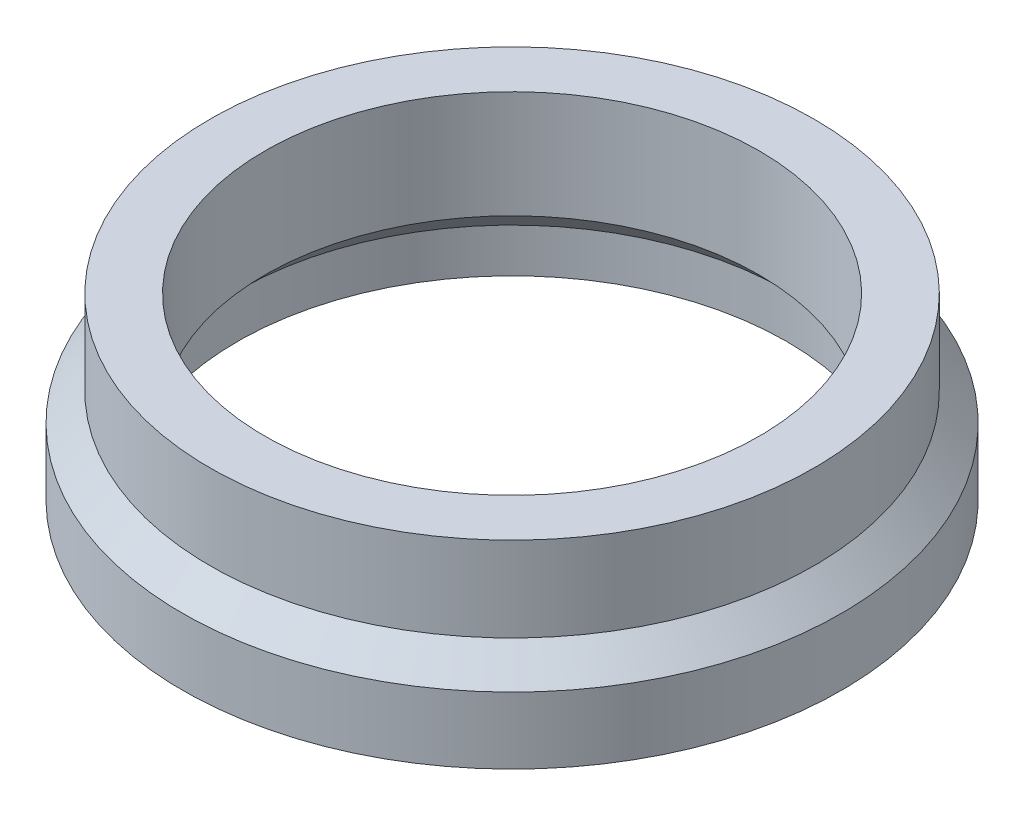
ISO-10303-21;
HEADER;
FILE_DESCRIPTION(('STEP AP214'),'2;1');
FILE_NAME('part.step','',(''),(''),'','','');
FILE_SCHEMA(('AUTOMOTIVE_DESIGN { 1 0 10303 214 1 1 1 1 }'));
ENDSEC;
DATA;
#1=APPLICATION_CONTEXT('core data for automotive mechanical design processes');
#2=APPLICATION_PROTOCOL_DEFINITION('international standard','automotive_design',2000,#1);
#3=PRODUCT_CONTEXT('',#1,'mechanical');
#4=PRODUCT('Part','Part','',(#3));
#5=PRODUCT_RELATED_PRODUCT_CATEGORY('part','',(#4));
#6=PRODUCT_DEFINITION_FORMATION('','',#4);
#7=PRODUCT_DEFINITION_CONTEXT('part definition',#1,'design');
#8=PRODUCT_DEFINITION('design','',#6,#7);
#9=PRODUCT_DEFINITION_SHAPE('','',#8);
#10=(LENGTH_UNIT() NAMED_UNIT(*) SI_UNIT(.MILLI.,.METRE.));
#11=(NAMED_UNIT(*) PLANE_ANGLE_UNIT() SI_UNIT($,.RADIAN.));
#12=(NAMED_UNIT(*) SI_UNIT($,.STERADIAN.) SOLID_ANGLE_UNIT());
#13=UNCERTAINTY_MEASURE_WITH_UNIT(LENGTH_MEASURE(1.E-05),#10,'distance_accuracy_value','');
#14=(GEOMETRIC_REPRESENTATION_CONTEXT(3) GLOBAL_UNCERTAINTY_ASSIGNED_CONTEXT((#13)) GLOBAL_UNIT_ASSIGNED_CONTEXT((#10,
#11,#12)) REPRESENTATION_CONTEXT('',''));
#15=CARTESIAN_POINT('',(0.,0.,0.));
#16=DIRECTION('',(0.,0.,1.));
#17=DIRECTION('',(1.,0.,0.));
#18=AXIS2_PLACEMENT_3D('',#15,#16,#17);
#19=CARTESIAN_POINT('',(-5.,0.,0.));
#20=DIRECTION('',(0.,1.,0.));
#21=DIRECTION('',(0.,0.,1.));
#22=AXIS2_PLACEMENT_3D('',#19,#20,#21);
#23=PLANE('',#22);
#24=CARTESIAN_POINT('',(0.,0.,0.));
#25=DIRECTION('',(0.,-1.,0.));
#26=DIRECTION('',(0.,0.,-1.));
#27=AXIS2_PLACEMENT_3D('',#24,#25,#26);
#28=CIRCLE('',#27,5.);
#29=CARTESIAN_POINT('',(0.,0.,-5.));
#30=VERTEX_POINT('',#29);
#31=EDGE_CURVE('E62',#30,#30,#28,.T.);
#32=ORIENTED_EDGE('',*,*,#31,.F.);
#33=EDGE_LOOP('',(#32));
#34=FACE_BOUND('',#33,.T.);
#35=CARTESIAN_POINT('',(0.,0.,0.));
#36=DIRECTION('',(0.,-1.,0.));
#37=DIRECTION('',(0.,0.,-1.));
#38=AXIS2_PLACEMENT_3D('',#35,#36,#37);
#39=CIRCLE('',#38,6.);
#40=CARTESIAN_POINT('',(0.,0.,-6.));
#41=VERTEX_POINT('',#40);
#42=EDGE_CURVE('E10',#41,#41,#39,.T.);
#43=ORIENTED_EDGE('',*,*,#42,.T.);
#44=EDGE_LOOP('',(#43));
#45=FACE_BOUND('',#44,.T.);
#46=ADVANCED_FACE('F34',(#34,#45),#23,.F.);
#47=CARTESIAN_POINT('',(0.,0.,0.));
#48=DIRECTION('',(0.,-1.,0.));
#49=DIRECTION('',(0.,0.,-1.));
#50=AXIS2_PLACEMENT_3D('',#47,#48,#49);
#51=CYLINDRICAL_SURFACE('',#50,6.);
#52=ORIENTED_EDGE('',*,*,#42,.F.);
#53=EDGE_LOOP('',(#52));
#54=FACE_BOUND('',#53,.T.);
#55=CARTESIAN_POINT('',(0.,1.2142135623731,0.));
#56=DIRECTION('',(0.,-1.,0.));
#57=DIRECTION('',(0.,0.,-1.));
#58=AXIS2_PLACEMENT_3D('',#55,#56,#57);
#59=CIRCLE('',#58,6.);
#60=CARTESIAN_POINT('',(0.,1.2142135623731,-6.));
#61=VERTEX_POINT('',#60);
#62=EDGE_CURVE('E40',#61,#61,#59,.T.);
#63=ORIENTED_EDGE('',*,*,#62,.T.);
#64=EDGE_LOOP('',(#63));
#65=FACE_BOUND('',#64,.T.);
#66=ADVANCED_FACE('F69',(#54,#65),#51,.T.);
#67=CARTESIAN_POINT('',(0.,1.7142135623731,0.));
#68=DIRECTION('',(0.,-1.,0.));
#69=DIRECTION('',(0.,0.,-1.));
#70=AXIS2_PLACEMENT_3D('',#67,#68,#69);
#71=CONICAL_SURFACE('',#70,5.5,0.785398163397448);
#72=ORIENTED_EDGE('',*,*,#62,.F.);
#73=EDGE_LOOP('',(#72));
#74=FACE_BOUND('',#73,.T.);
#75=CARTESIAN_POINT('',(0.,1.7142135623731,0.));
#76=DIRECTION('',(0.,-1.,0.));
#77=DIRECTION('',(0.,0.,-1.));
#78=AXIS2_PLACEMENT_3D('',#75,#76,#77);
#79=CIRCLE('',#78,5.5);
#80=CARTESIAN_POINT('',(0.,1.7142135623731,-5.5));
#81=VERTEX_POINT('',#80);
#82=EDGE_CURVE('E44',#81,#81,#79,.T.);
#83=ORIENTED_EDGE('',*,*,#82,.T.);
#84=EDGE_LOOP('',(#83));
#85=FACE_BOUND('',#84,.T.);
#86=ADVANCED_FACE('F73',(#74,#85),#71,.T.);
#87=CARTESIAN_POINT('',(0.,0.,0.));
#88=DIRECTION('',(0.,-1.,0.));
#89=DIRECTION('',(0.,0.,-1.));
#90=AXIS2_PLACEMENT_3D('',#87,#88,#89);
#91=CYLINDRICAL_SURFACE('',#90,5.5);
#92=ORIENTED_EDGE('',*,*,#82,.F.);
#93=EDGE_LOOP('',(#92));
#94=FACE_BOUND('',#93,.T.);
#95=CARTESIAN_POINT('',(0.,3.25638793857598,0.));
#96=DIRECTION('',(0.,-1.,0.));
#97=DIRECTION('',(0.,0.,-1.));
#98=AXIS2_PLACEMENT_3D('',#95,#96,#97);
#99=CIRCLE('',#98,5.5);
#100=CARTESIAN_POINT('',(0.,3.25638793857598,-5.5));
#101=VERTEX_POINT('',#100);
#102=EDGE_CURVE('E48',#101,#101,#99,.T.);
#103=ORIENTED_EDGE('',*,*,#102,.T.);
#104=EDGE_LOOP('',(#103));
#105=FACE_BOUND('',#104,.T.);
#106=ADVANCED_FACE('F78',(#94,#105),#91,.T.);
#107=CARTESIAN_POINT('',(-5.5,3.25638793857598,0.));
#108=DIRECTION('',(0.,-1.,0.));
#109=DIRECTION('',(0.,0.,-1.));
#110=AXIS2_PLACEMENT_3D('',#107,#108,#109);
#111=PLANE('',#110);
#112=ORIENTED_EDGE('',*,*,#102,.F.);
#113=EDGE_LOOP('',(#112));
#114=FACE_BOUND('',#113,.T.);
#115=CARTESIAN_POINT('',(0.,3.25638793857598,0.));
#116=DIRECTION('',(0.,-1.,0.));
#117=DIRECTION('',(0.,0.,-1.));
#118=AXIS2_PLACEMENT_3D('',#115,#116,#117);
#119=CIRCLE('',#118,4.5);
#120=CARTESIAN_POINT('',(0.,3.25638793857598,-4.5));
#121=VERTEX_POINT('',#120);
#122=EDGE_CURVE('E53',#121,#121,#119,.T.);
#123=ORIENTED_EDGE('',*,*,#122,.T.);
#124=EDGE_LOOP('',(#123));
#125=FACE_BOUND('',#124,.T.);
#126=ADVANCED_FACE('F84',(#114,#125),#111,.F.);
#127=CARTESIAN_POINT('',(0.,0.,0.));
#128=DIRECTION('',(0.,-1.,0.));
#129=DIRECTION('',(0.,0.,-1.));
#130=AXIS2_PLACEMENT_3D('',#127,#128,#129);
#131=CYLINDRICAL_SURFACE('',#130,4.5);
#132=ORIENTED_EDGE('',*,*,#122,.F.);
#133=EDGE_LOOP('',(#132));
#134=FACE_BOUND('',#133,.T.);
#135=CARTESIAN_POINT('',(0.,1.3,0.));
#136=DIRECTION('',(0.,-1.,0.));
#137=DIRECTION('',(0.,0.,-1.));
#138=AXIS2_PLACEMENT_3D('',#135,#136,#137);
#139=CIRCLE('',#138,4.5);
#140=CARTESIAN_POINT('',(0.,1.3,-4.5));
#141=VERTEX_POINT('',#140);
#142=EDGE_CURVE('E56',#141,#141,#139,.T.);
#143=ORIENTED_EDGE('',*,*,#142,.T.);
#144=EDGE_LOOP('',(#143));
#145=FACE_BOUND('',#144,.T.);
#146=ADVANCED_FACE('F88',(#134,#145),#131,.F.);
#147=CARTESIAN_POINT('',(0.,0.8,0.));
#148=DIRECTION('',(0.,-1.,0.));
#149=DIRECTION('',(0.,0.,-1.));
#150=AXIS2_PLACEMENT_3D('',#147,#148,#149);
#151=CONICAL_SURFACE('',#150,5.,0.785398163397448);
#152=ORIENTED_EDGE('',*,*,#142,.F.);
#153=EDGE_LOOP('',(#152));
#154=FACE_BOUND('',#153,.T.);
#155=CARTESIAN_POINT('',(0.,0.8,0.));
#156=DIRECTION('',(0.,-1.,0.));
#157=DIRECTION('',(0.,0.,-1.));
#158=AXIS2_PLACEMENT_3D('',#155,#156,#157);
#159=CIRCLE('',#158,5.);
#160=CARTESIAN_POINT('',(0.,0.8,-5.));
#161=VERTEX_POINT('',#160);
#162=EDGE_CURVE('E59',#161,#161,#159,.T.);
#163=ORIENTED_EDGE('',*,*,#162,.T.);
#164=EDGE_LOOP('',(#163));
#165=FACE_BOUND('',#164,.T.);
#166=ADVANCED_FACE('F92',(#154,#165),#151,.F.);
#167=CARTESIAN_POINT('',(0.,0.,0.));
#168=DIRECTION('',(0.,-1.,0.));
#169=DIRECTION('',(0.,0.,-1.));
#170=AXIS2_PLACEMENT_3D('',#167,#168,#169);
#171=CYLINDRICAL_SURFACE('',#170,5.);
#172=ORIENTED_EDGE('',*,*,#162,.F.);
#173=EDGE_LOOP('',(#172));
#174=FACE_BOUND('',#173,.T.);
#175=ORIENTED_EDGE('',*,*,#31,.T.);
#176=EDGE_LOOP('',(#175));
#177=FACE_BOUND('',#176,.T.);
#178=ADVANCED_FACE('F66',(#174,#177),#171,.F.);
#179=CLOSED_SHELL('',(#46,#66,#86,#106,#126,#146,#166,#178));
#180=MANIFOLD_SOLID_BREP('B2',#179);
#181=ADVANCED_BREP_SHAPE_REPRESENTATION('',(#18,#180),#14);
#182=SHAPE_DEFINITION_REPRESENTATION(#9,#181);
ENDSEC;
END-ISO-10303-21;
